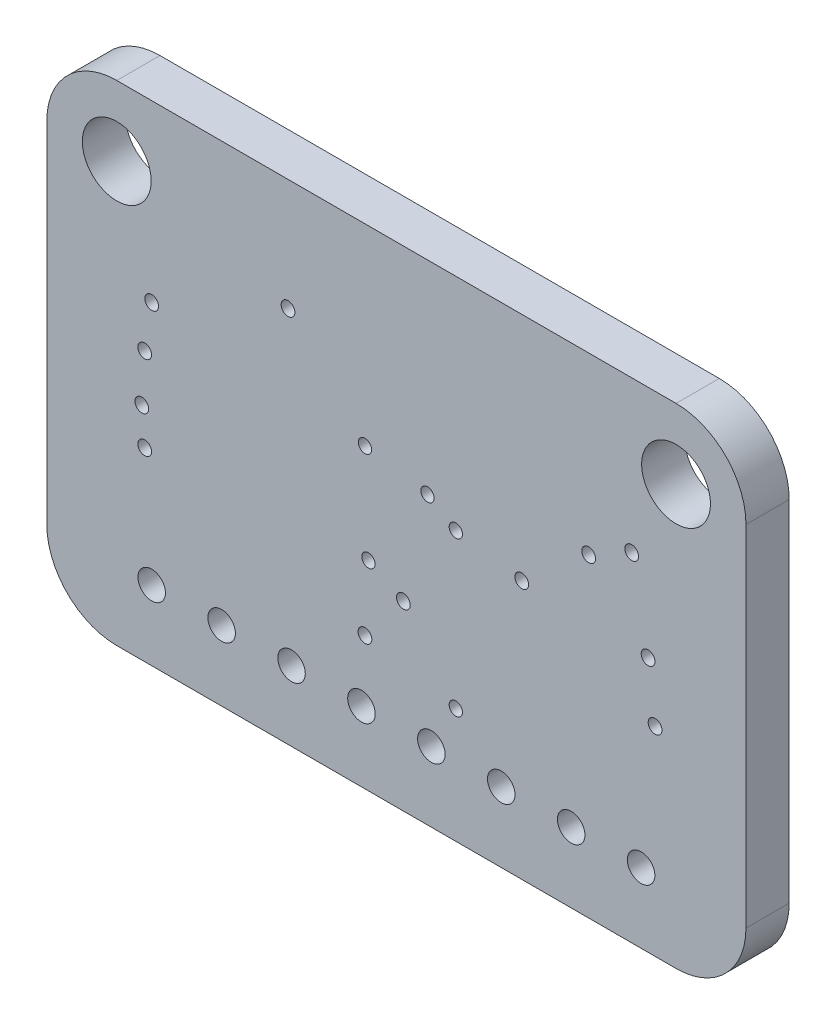
ISO-10303-21;
HEADER;
FILE_DESCRIPTION(('STEP AP214'),'2;1');
FILE_NAME('part.step','',(''),(''),'','','');
FILE_SCHEMA(('AUTOMOTIVE_DESIGN { 1 0 10303 214 1 1 1 1 }'));
ENDSEC;
DATA;
#1=APPLICATION_CONTEXT('core data for automotive mechanical design processes');
#2=APPLICATION_PROTOCOL_DEFINITION('international standard','automotive_design',2000,#1);
#3=PRODUCT_CONTEXT('',#1,'mechanical');
#4=PRODUCT('Part','Part','',(#3));
#5=PRODUCT_RELATED_PRODUCT_CATEGORY('part','',(#4));
#6=PRODUCT_DEFINITION_FORMATION('','',#4);
#7=PRODUCT_DEFINITION_CONTEXT('part definition',#1,'design');
#8=PRODUCT_DEFINITION('design','',#6,#7);
#9=PRODUCT_DEFINITION_SHAPE('','',#8);
#10=(LENGTH_UNIT() NAMED_UNIT(*) SI_UNIT(.MILLI.,.METRE.));
#11=(NAMED_UNIT(*) PLANE_ANGLE_UNIT() SI_UNIT($,.RADIAN.));
#12=(NAMED_UNIT(*) SI_UNIT($,.STERADIAN.) SOLID_ANGLE_UNIT());
#13=UNCERTAINTY_MEASURE_WITH_UNIT(LENGTH_MEASURE(1.E-05),#10,'distance_accuracy_value','');
#14=(GEOMETRIC_REPRESENTATION_CONTEXT(3) GLOBAL_UNCERTAINTY_ASSIGNED_CONTEXT((#13)) GLOBAL_UNIT_ASSIGNED_CONTEXT((#10,
#11,#12)) REPRESENTATION_CONTEXT('',''));
#15=CARTESIAN_POINT('',(0.,0.,0.));
#16=DIRECTION('',(0.,0.,1.));
#17=DIRECTION('',(1.,0.,0.));
#18=AXIS2_PLACEMENT_3D('',#15,#16,#17);
#19=CARTESIAN_POINT('',(12.7,8.89,1.57));
#20=DIRECTION('',(0.,0.,1.));
#21=DIRECTION('',(1.,0.,0.));
#22=AXIS2_PLACEMENT_3D('',#19,#20,#21);
#23=PLANE('',#22);
#24=CARTESIAN_POINT('',(22.86,15.24,1.57));
#25=DIRECTION('',(0.,0.,1.));
#26=DIRECTION('',(1.,0.,0.));
#27=AXIS2_PLACEMENT_3D('',#24,#25,#26);
#28=CIRCLE('',#27,1.25);
#29=CARTESIAN_POINT('',(24.11,15.24,1.57));
#30=VERTEX_POINT('',#29);
#31=EDGE_CURVE('E207',#30,#30,#28,.F.);
#32=ORIENTED_EDGE('',*,*,#31,.T.);
#33=EDGE_LOOP('',(#32));
#34=FACE_BOUND('',#33,.T.);
#35=CARTESIAN_POINT('',(21.59,2.54,1.57));
#36=DIRECTION('',(0.,0.,1.));
#37=DIRECTION('',(1.,0.,0.));
#38=AXIS2_PLACEMENT_3D('',#35,#36,#37);
#39=CIRCLE('',#38,0.5);
#40=CARTESIAN_POINT('',(22.09,2.54,1.57));
#41=VERTEX_POINT('',#40);
#42=EDGE_CURVE('E210',#41,#41,#39,.F.);
#43=ORIENTED_EDGE('',*,*,#42,.T.);
#44=EDGE_LOOP('',(#43));
#45=FACE_BOUND('',#44,.T.);
#46=CARTESIAN_POINT('',(16.51,2.54,1.57));
#47=DIRECTION('',(0.,0.,1.));
#48=DIRECTION('',(1.,0.,0.));
#49=AXIS2_PLACEMENT_3D('',#46,#47,#48);
#50=CIRCLE('',#49,0.5);
#51=CARTESIAN_POINT('',(17.01,2.54,1.57));
#52=VERTEX_POINT('',#51);
#53=EDGE_CURVE('E213',#52,#52,#50,.F.);
#54=ORIENTED_EDGE('',*,*,#53,.T.);
#55=EDGE_LOOP('',(#54));
#56=FACE_BOUND('',#55,.T.);
#57=CARTESIAN_POINT('',(11.43,2.54,1.57));
#58=DIRECTION('',(0.,0.,1.));
#59=DIRECTION('',(1.,0.,0.));
#60=AXIS2_PLACEMENT_3D('',#57,#58,#59);
#61=CIRCLE('',#60,0.5);
#62=CARTESIAN_POINT('',(11.93,2.54,1.57));
#63=VERTEX_POINT('',#62);
#64=EDGE_CURVE('E216',#63,#63,#61,.F.);
#65=ORIENTED_EDGE('',*,*,#64,.T.);
#66=EDGE_LOOP('',(#65));
#67=FACE_BOUND('',#66,.T.);
#68=CARTESIAN_POINT('',(6.35,2.54,1.57));
#69=DIRECTION('',(0.,0.,1.));
#70=DIRECTION('',(1.,0.,0.));
#71=AXIS2_PLACEMENT_3D('',#68,#69,#70);
#72=CIRCLE('',#71,0.5);
#73=CARTESIAN_POINT('',(6.85,2.54,1.57));
#74=VERTEX_POINT('',#73);
#75=EDGE_CURVE('E219',#74,#74,#72,.F.);
#76=ORIENTED_EDGE('',*,*,#75,.T.);
#77=EDGE_LOOP('',(#76));
#78=FACE_BOUND('',#77,.T.);
#79=CARTESIAN_POINT('',(3.556,9.779,1.57));
#80=DIRECTION('',(0.,0.,1.));
#81=DIRECTION('',(1.,0.,0.));
#82=AXIS2_PLACEMENT_3D('',#79,#80,#81);
#83=CIRCLE('',#82,0.25);
#84=CARTESIAN_POINT('',(3.806,9.779,1.57));
#85=VERTEX_POINT('',#84);
#86=EDGE_CURVE('E222',#85,#85,#83,.F.);
#87=ORIENTED_EDGE('',*,*,#86,.T.);
#88=EDGE_LOOP('',(#87));
#89=FACE_BOUND('',#88,.T.);
#90=CARTESIAN_POINT('',(11.557,10.79,1.57));
#91=DIRECTION('',(0.,0.,1.));
#92=DIRECTION('',(1.,0.,0.));
#93=AXIS2_PLACEMENT_3D('',#90,#91,#92);
#94=CIRCLE('',#93,0.2415);
#95=CARTESIAN_POINT('',(11.7985,10.79,1.57));
#96=VERTEX_POINT('',#95);
#97=EDGE_CURVE('E225',#96,#96,#94,.F.);
#98=ORIENTED_EDGE('',*,*,#97,.T.);
#99=EDGE_LOOP('',(#98));
#100=FACE_BOUND('',#99,.T.);
#101=CARTESIAN_POINT('',(11.557,4.826,1.57));
#102=DIRECTION('',(0.,0.,1.));
#103=DIRECTION('',(1.,0.,0.));
#104=AXIS2_PLACEMENT_3D('',#101,#102,#103);
#105=CIRCLE('',#104,0.25);
#106=CARTESIAN_POINT('',(11.807,4.826,1.57));
#107=VERTEX_POINT('',#106);
#108=EDGE_CURVE('E228',#107,#107,#105,.F.);
#109=ORIENTED_EDGE('',*,*,#108,.T.);
#110=EDGE_LOOP('',(#109));
#111=FACE_BOUND('',#110,.T.);
#112=CARTESIAN_POINT('',(17.253,9.398,1.57));
#113=DIRECTION('',(0.,0.,1.));
#114=DIRECTION('',(1.,0.,0.));
#115=AXIS2_PLACEMENT_3D('',#112,#113,#114);
#116=CIRCLE('',#115,0.25);
#117=CARTESIAN_POINT('',(17.503,9.398,1.57));
#118=VERTEX_POINT('',#117);
#119=EDGE_CURVE('E231',#118,#118,#116,.F.);
#120=ORIENTED_EDGE('',*,*,#119,.T.);
#121=EDGE_LOOP('',(#120));
#122=FACE_BOUND('',#121,.T.);
#123=CARTESIAN_POINT('',(3.452,8.024,1.57));
#124=DIRECTION('',(0.,0.,1.));
#125=DIRECTION('',(1.,0.,0.));
#126=AXIS2_PLACEMENT_3D('',#123,#124,#125);
#127=CIRCLE('',#126,0.25);
#128=CARTESIAN_POINT('',(3.702,8.024,1.57));
#129=VERTEX_POINT('',#128);
#130=EDGE_CURVE('E234',#129,#129,#127,.F.);
#131=ORIENTED_EDGE('',*,*,#130,.T.);
#132=EDGE_LOOP('',(#131));
#133=FACE_BOUND('',#132,.T.);
#134=CARTESIAN_POINT('',(14.859,4.178,1.57));
#135=DIRECTION('',(0.,0.,1.));
#136=DIRECTION('',(1.,0.,0.));
#137=AXIS2_PLACEMENT_3D('',#134,#135,#136);
#138=CIRCLE('',#137,0.2415);
#139=CARTESIAN_POINT('',(15.1005,4.178,1.57));
#140=VERTEX_POINT('',#139);
#141=EDGE_CURVE('E237',#140,#140,#138,.F.);
#142=ORIENTED_EDGE('',*,*,#141,.T.);
#143=EDGE_LOOP('',(#142));
#144=FACE_BOUND('',#143,.T.);
#145=CARTESIAN_POINT('',(11.684,7.252,1.57));
#146=DIRECTION('',(0.,0.,1.));
#147=DIRECTION('',(1.,0.,0.));
#148=AXIS2_PLACEMENT_3D('',#145,#146,#147);
#149=CIRCLE('',#148,0.2415);
#150=CARTESIAN_POINT('',(11.9255,7.252,1.57));
#151=VERTEX_POINT('',#150);
#152=EDGE_CURVE('E240',#151,#151,#149,.F.);
#153=ORIENTED_EDGE('',*,*,#152,.T.);
#154=EDGE_LOOP('',(#153));
#155=FACE_BOUND('',#154,.T.);
#156=CARTESIAN_POINT('',(12.954,6.604,1.57));
#157=DIRECTION('',(0.,0.,1.));
#158=DIRECTION('',(1.,0.,0.));
#159=AXIS2_PLACEMENT_3D('',#156,#157,#158);
#160=CIRCLE('',#159,0.25);
#161=CARTESIAN_POINT('',(13.204,6.604,1.57));
#162=VERTEX_POINT('',#161);
#163=EDGE_CURVE('E243',#162,#162,#160,.F.);
#164=ORIENTED_EDGE('',*,*,#163,.T.);
#165=EDGE_LOOP('',(#164));
#166=FACE_BOUND('',#165,.T.);
#167=CARTESIAN_POINT('',(22.098,7.239,1.57));
#168=DIRECTION('',(0.,0.,1.));
#169=DIRECTION('',(1.,0.,0.));
#170=AXIS2_PLACEMENT_3D('',#167,#168,#169);
#171=CIRCLE('',#170,0.25);
#172=CARTESIAN_POINT('',(22.348,7.239,1.57));
#173=VERTEX_POINT('',#172);
#174=EDGE_CURVE('E246',#173,#173,#171,.F.);
#175=ORIENTED_EDGE('',*,*,#174,.T.);
#176=EDGE_LOOP('',(#175));
#177=FACE_BOUND('',#176,.T.);
#178=CARTESIAN_POINT('',(8.763,13.716,1.57));
#179=DIRECTION('',(0.,0.,1.));
#180=DIRECTION('',(1.,0.,0.));
#181=AXIS2_PLACEMENT_3D('',#178,#179,#180);
#182=CIRCLE('',#181,0.25);
#183=CARTESIAN_POINT('',(9.013,13.716,1.57));
#184=VERTEX_POINT('',#183);
#185=EDGE_CURVE('E249',#184,#184,#182,.F.);
#186=ORIENTED_EDGE('',*,*,#185,.T.);
#187=EDGE_LOOP('',(#186));
#188=FACE_BOUND('',#187,.T.);
#189=CARTESIAN_POINT('',(19.685,11.43,1.57));
#190=DIRECTION('',(0.,0.,1.));
#191=DIRECTION('',(1.,0.,0.));
#192=AXIS2_PLACEMENT_3D('',#189,#190,#191);
#193=CIRCLE('',#192,0.25);
#194=CARTESIAN_POINT('',(19.935,11.43,1.57));
#195=VERTEX_POINT('',#194);
#196=EDGE_CURVE('E252',#195,#195,#193,.F.);
#197=ORIENTED_EDGE('',*,*,#196,.T.);
#198=EDGE_LOOP('',(#197));
#199=FACE_BOUND('',#198,.T.);
#200=CARTESIAN_POINT('',(13.83,10.401,1.57));
#201=DIRECTION('',(0.,0.,1.));
#202=DIRECTION('',(1.,0.,0.));
#203=AXIS2_PLACEMENT_3D('',#200,#201,#202);
#204=CIRCLE('',#203,0.2415);
#205=CARTESIAN_POINT('',(14.0715,10.401,1.57));
#206=VERTEX_POINT('',#205);
#207=EDGE_CURVE('E255',#206,#206,#204,.F.);
#208=ORIENTED_EDGE('',*,*,#207,.T.);
#209=EDGE_LOOP('',(#208));
#210=FACE_BOUND('',#209,.T.);
#211=CARTESIAN_POINT('',(14.859,9.779,1.57));
#212=DIRECTION('',(0.,0.,1.));
#213=DIRECTION('',(1.,0.,0.));
#214=AXIS2_PLACEMENT_3D('',#211,#212,#213);
#215=CIRCLE('',#214,0.2415);
#216=CARTESIAN_POINT('',(15.1005,9.779,1.57));
#217=VERTEX_POINT('',#216);
#218=EDGE_CURVE('E258',#217,#217,#215,.F.);
#219=ORIENTED_EDGE('',*,*,#218,.T.);
#220=EDGE_LOOP('',(#219));
#221=FACE_BOUND('',#220,.T.);
#222=CARTESIAN_POINT('',(21.844,9.271,1.57));
#223=DIRECTION('',(0.,0.,1.));
#224=DIRECTION('',(1.,0.,0.));
#225=AXIS2_PLACEMENT_3D('',#222,#223,#224);
#226=CIRCLE('',#225,0.25);
#227=CARTESIAN_POINT('',(22.094,9.271,1.57));
#228=VERTEX_POINT('',#227);
#229=EDGE_CURVE('E261',#228,#228,#226,.F.);
#230=ORIENTED_EDGE('',*,*,#229,.T.);
#231=EDGE_LOOP('',(#230));
#232=FACE_BOUND('',#231,.T.);
#233=CARTESIAN_POINT('',(3.556,6.731,1.57));
#234=DIRECTION('',(0.,0.,1.));
#235=DIRECTION('',(1.,0.,0.));
#236=AXIS2_PLACEMENT_3D('',#233,#234,#235);
#237=CIRCLE('',#236,0.25);
#238=CARTESIAN_POINT('',(3.806,6.731,1.57));
#239=VERTEX_POINT('',#238);
#240=EDGE_CURVE('E264',#239,#239,#237,.F.);
#241=ORIENTED_EDGE('',*,*,#240,.T.);
#242=EDGE_LOOP('',(#241));
#243=FACE_BOUND('',#242,.T.);
#244=CARTESIAN_POINT('',(3.81,11.43,1.57));
#245=DIRECTION('',(0.,0.,1.));
#246=DIRECTION('',(1.,0.,0.));
#247=AXIS2_PLACEMENT_3D('',#244,#245,#246);
#248=CIRCLE('',#247,0.25);
#249=CARTESIAN_POINT('',(4.06,11.43,1.57));
#250=VERTEX_POINT('',#249);
#251=EDGE_CURVE('E267',#250,#250,#248,.F.);
#252=ORIENTED_EDGE('',*,*,#251,.T.);
#253=EDGE_LOOP('',(#252));
#254=FACE_BOUND('',#253,.T.);
#255=CARTESIAN_POINT('',(21.248,12.28,1.57));
#256=DIRECTION('',(0.,0.,1.));
#257=DIRECTION('',(1.,0.,0.));
#258=AXIS2_PLACEMENT_3D('',#255,#256,#257);
#259=CIRCLE('',#258,0.25);
#260=CARTESIAN_POINT('',(21.498,12.28,1.57));
#261=VERTEX_POINT('',#260);
#262=EDGE_CURVE('E270',#261,#261,#259,.F.);
#263=ORIENTED_EDGE('',*,*,#262,.T.);
#264=EDGE_LOOP('',(#263));
#265=FACE_BOUND('',#264,.T.);
#266=CARTESIAN_POINT('',(3.81,2.54,1.57));
#267=DIRECTION('',(0.,0.,1.));
#268=DIRECTION('',(1.,0.,0.));
#269=AXIS2_PLACEMENT_3D('',#266,#267,#268);
#270=CIRCLE('',#269,0.5);
#271=CARTESIAN_POINT('',(4.31,2.54,1.57));
#272=VERTEX_POINT('',#271);
#273=EDGE_CURVE('E273',#272,#272,#270,.F.);
#274=ORIENTED_EDGE('',*,*,#273,.T.);
#275=EDGE_LOOP('',(#274));
#276=FACE_BOUND('',#275,.T.);
#277=CARTESIAN_POINT('',(8.89,2.54,1.57));
#278=DIRECTION('',(0.,0.,1.));
#279=DIRECTION('',(1.,0.,0.));
#280=AXIS2_PLACEMENT_3D('',#277,#278,#279);
#281=CIRCLE('',#280,0.5);
#282=CARTESIAN_POINT('',(9.39,2.54,1.57));
#283=VERTEX_POINT('',#282);
#284=EDGE_CURVE('E276',#283,#283,#281,.F.);
#285=ORIENTED_EDGE('',*,*,#284,.T.);
#286=EDGE_LOOP('',(#285));
#287=FACE_BOUND('',#286,.T.);
#288=CARTESIAN_POINT('',(13.97,2.54,1.57));
#289=DIRECTION('',(0.,0.,1.));
#290=DIRECTION('',(1.,0.,0.));
#291=AXIS2_PLACEMENT_3D('',#288,#289,#290);
#292=CIRCLE('',#291,0.5);
#293=CARTESIAN_POINT('',(14.47,2.54,1.57));
#294=VERTEX_POINT('',#293);
#295=EDGE_CURVE('E279',#294,#294,#292,.F.);
#296=ORIENTED_EDGE('',*,*,#295,.T.);
#297=EDGE_LOOP('',(#296));
#298=FACE_BOUND('',#297,.T.);
#299=CARTESIAN_POINT('',(19.05,2.54,1.57));
#300=DIRECTION('',(0.,0.,1.));
#301=DIRECTION('',(1.,0.,0.));
#302=AXIS2_PLACEMENT_3D('',#299,#300,#301);
#303=CIRCLE('',#302,0.5);
#304=CARTESIAN_POINT('',(19.55,2.54,1.57));
#305=VERTEX_POINT('',#304);
#306=EDGE_CURVE('E282',#305,#305,#303,.F.);
#307=ORIENTED_EDGE('',*,*,#306,.T.);
#308=EDGE_LOOP('',(#307));
#309=FACE_BOUND('',#308,.T.);
#310=CARTESIAN_POINT('',(2.54,15.24,1.57));
#311=DIRECTION('',(0.,0.,1.));
#312=DIRECTION('',(1.,0.,0.));
#313=AXIS2_PLACEMENT_3D('',#310,#311,#312);
#314=CIRCLE('',#313,1.25);
#315=CARTESIAN_POINT('',(3.79,15.24,1.57));
#316=VERTEX_POINT('',#315);
#317=EDGE_CURVE('E285',#316,#316,#314,.F.);
#318=ORIENTED_EDGE('',*,*,#317,.T.);
#319=EDGE_LOOP('',(#318));
#320=FACE_BOUND('',#319,.T.);
#321=CARTESIAN_POINT('',(22.86,15.24,1.57));
#322=DIRECTION('',(0.,0.,1.));
#323=DIRECTION('',(1.,0.,0.));
#324=AXIS2_PLACEMENT_3D('',#321,#322,#323);
#325=CIRCLE('',#324,2.54);
#326=CARTESIAN_POINT('',(22.86,17.78,1.57));
#327=VERTEX_POINT('',#326);
#328=CARTESIAN_POINT('',(25.4,15.24,1.57));
#329=VERTEX_POINT('',#328);
#330=EDGE_CURVE('E290',#327,#329,#325,.F.);
#331=ORIENTED_EDGE('',*,*,#330,.F.);
#332=DIRECTION('',(1.,0.,0.));
#333=VECTOR('',#332,1.);
#334=CARTESIAN_POINT('',(22.86,17.78,1.57));
#335=LINE('',#334,#333);
#336=CARTESIAN_POINT('',(2.54,17.78,1.57));
#337=VERTEX_POINT('',#336);
#338=EDGE_CURVE('E109',#337,#327,#335,.T.);
#339=ORIENTED_EDGE('',*,*,#338,.F.);
#340=CARTESIAN_POINT('',(2.54,15.24,1.57));
#341=DIRECTION('',(0.,0.,1.));
#342=DIRECTION('',(1.,0.,0.));
#343=AXIS2_PLACEMENT_3D('',#340,#341,#342);
#344=CIRCLE('',#343,2.54);
#345=CARTESIAN_POINT('',(0.,15.24,1.57));
#346=VERTEX_POINT('',#345);
#347=EDGE_CURVE('E96',#346,#337,#344,.F.);
#348=ORIENTED_EDGE('',*,*,#347,.F.);
#349=DIRECTION('',(0.,1.,0.));
#350=VECTOR('',#349,1.);
#351=CARTESIAN_POINT('',(0.,15.24,1.57));
#352=LINE('',#351,#350);
#353=CARTESIAN_POINT('',(0.,2.54,1.57));
#354=VERTEX_POINT('',#353);
#355=EDGE_CURVE('E92',#354,#346,#352,.T.);
#356=ORIENTED_EDGE('',*,*,#355,.F.);
#357=CARTESIAN_POINT('',(2.54,2.54,1.57));
#358=DIRECTION('',(0.,0.,1.));
#359=DIRECTION('',(1.,0.,0.));
#360=AXIS2_PLACEMENT_3D('',#357,#358,#359);
#361=CIRCLE('',#360,2.54);
#362=CARTESIAN_POINT('',(2.54,0.,1.57));
#363=VERTEX_POINT('',#362);
#364=EDGE_CURVE('E20',#363,#354,#361,.F.);
#365=ORIENTED_EDGE('',*,*,#364,.F.);
#366=DIRECTION('',(1.,0.,0.));
#367=VECTOR('',#366,1.);
#368=CARTESIAN_POINT('',(2.54,0.,1.57));
#369=LINE('',#368,#367);
#370=CARTESIAN_POINT('',(22.86,0.,1.57));
#371=VERTEX_POINT('',#370);
#372=EDGE_CURVE('E79',#371,#363,#369,.F.);
#373=ORIENTED_EDGE('',*,*,#372,.F.);
#374=CARTESIAN_POINT('',(22.86,2.54,1.57));
#375=DIRECTION('',(0.,0.,1.));
#376=DIRECTION('',(1.,0.,0.));
#377=AXIS2_PLACEMENT_3D('',#374,#375,#376);
#378=CIRCLE('',#377,2.54);
#379=CARTESIAN_POINT('',(25.4,2.54,1.57));
#380=VERTEX_POINT('',#379);
#381=EDGE_CURVE('E291',#380,#371,#378,.F.);
#382=ORIENTED_EDGE('',*,*,#381,.F.);
#383=DIRECTION('',(0.,1.,0.));
#384=VECTOR('',#383,1.);
#385=CARTESIAN_POINT('',(25.4,2.54,1.57));
#386=LINE('',#385,#384);
#387=EDGE_CURVE('E113',#329,#380,#386,.F.);
#388=ORIENTED_EDGE('',*,*,#387,.F.);
#389=EDGE_LOOP('',(#331,#339,#348,#356,#365,#373,#382,#388));
#390=FACE_BOUND('',#389,.T.);
#391=ADVANCED_FACE('F17',(#34,#45,#56,#67,#78,#89,#100,#111,#122,#133,#144,#155,#166,#177,#188,
#199,#210,#221,#232,#243,#254,#265,#276,#287,#298,#309,#320,#390),#23,.T.);
#392=CARTESIAN_POINT('',(0.,15.24,0.));
#393=DIRECTION('',(-1.,0.,0.));
#394=DIRECTION('',(0.,0.,1.));
#395=AXIS2_PLACEMENT_3D('',#392,#393,#394);
#396=PLANE('',#395);
#397=ORIENTED_EDGE('',*,*,#355,.T.);
#398=DIRECTION('',(0.,0.,1.));
#399=VECTOR('',#398,1.);
#400=CARTESIAN_POINT('',(0.,15.24,0.));
#401=LINE('',#400,#399);
#402=CARTESIAN_POINT('',(0.,15.24,0.));
#403=VERTEX_POINT('',#402);
#404=EDGE_CURVE('E289',#403,#346,#401,.T.);
#405=ORIENTED_EDGE('',*,*,#404,.F.);
#406=DIRECTION('',(0.,1.,0.));
#407=VECTOR('',#406,1.);
#408=CARTESIAN_POINT('',(0.,8.89,0.));
#409=LINE('',#408,#407);
#410=CARTESIAN_POINT('',(0.,2.54,0.));
#411=VERTEX_POINT('',#410);
#412=EDGE_CURVE('E103',#403,#411,#409,.F.);
#413=ORIENTED_EDGE('',*,*,#412,.T.);
#414=DIRECTION('',(0.,0.,1.));
#415=VECTOR('',#414,1.);
#416=CARTESIAN_POINT('',(0.,2.54,0.));
#417=LINE('',#416,#415);
#418=EDGE_CURVE('E88',#354,#411,#417,.F.);
#419=ORIENTED_EDGE('',*,*,#418,.F.);
#420=EDGE_LOOP('',(#397,#405,#413,#419));
#421=FACE_BOUND('',#420,.T.);
#422=ADVANCED_FACE('F102',(#421),#396,.T.);
#423=CARTESIAN_POINT('',(2.54,2.54,0.));
#424=DIRECTION('',(0.,0.,1.));
#425=DIRECTION('',(1.,0.,0.));
#426=AXIS2_PLACEMENT_3D('',#423,#424,#425);
#427=CYLINDRICAL_SURFACE('',#426,2.54);
#428=ORIENTED_EDGE('',*,*,#364,.T.);
#429=ORIENTED_EDGE('',*,*,#418,.T.);
#430=CARTESIAN_POINT('',(2.54,2.54,0.));
#431=DIRECTION('',(0.,0.,1.));
#432=DIRECTION('',(1.,0.,0.));
#433=AXIS2_PLACEMENT_3D('',#430,#431,#432);
#434=CIRCLE('',#433,2.54);
#435=CARTESIAN_POINT('',(2.54,0.,0.));
#436=VERTEX_POINT('',#435);
#437=EDGE_CURVE('E205',#411,#436,#434,.T.);
#438=ORIENTED_EDGE('',*,*,#437,.T.);
#439=DIRECTION('',(0.,0.,-1.));
#440=VECTOR('',#439,1.);
#441=CARTESIAN_POINT('',(2.54,0.,0.));
#442=LINE('',#441,#440);
#443=EDGE_CURVE('E90',#363,#436,#442,.T.);
#444=ORIENTED_EDGE('',*,*,#443,.F.);
#445=EDGE_LOOP('',(#428,#429,#438,#444));
#446=FACE_BOUND('',#445,.T.);
#447=ADVANCED_FACE('F85',(#446),#427,.T.);
#448=CARTESIAN_POINT('',(2.54,0.,0.));
#449=DIRECTION('',(0.,-1.,0.));
#450=DIRECTION('',(0.,0.,-1.));
#451=AXIS2_PLACEMENT_3D('',#448,#449,#450);
#452=PLANE('',#451);
#453=ORIENTED_EDGE('',*,*,#372,.T.);
#454=ORIENTED_EDGE('',*,*,#443,.T.);
#455=DIRECTION('',(1.,0.,0.));
#456=VECTOR('',#455,1.);
#457=CARTESIAN_POINT('',(12.7,0.,0.));
#458=LINE('',#457,#456);
#459=CARTESIAN_POINT('',(22.86,0.,0.));
#460=VERTEX_POINT('',#459);
#461=EDGE_CURVE('E204',#436,#460,#458,.T.);
#462=ORIENTED_EDGE('',*,*,#461,.T.);
#463=DIRECTION('',(0.,0.,1.));
#464=VECTOR('',#463,1.);
#465=CARTESIAN_POINT('',(22.86,0.,0.));
#466=LINE('',#465,#464);
#467=EDGE_CURVE('E115',#371,#460,#466,.F.);
#468=ORIENTED_EDGE('',*,*,#467,.F.);
#469=EDGE_LOOP('',(#453,#454,#462,#468));
#470=FACE_BOUND('',#469,.T.);
#471=ADVANCED_FACE('F297',(#470),#452,.T.);
#472=CARTESIAN_POINT('',(22.86,2.54,0.));
#473=DIRECTION('',(0.,0.,1.));
#474=DIRECTION('',(1.,0.,0.));
#475=AXIS2_PLACEMENT_3D('',#472,#473,#474);
#476=CYLINDRICAL_SURFACE('',#475,2.54);
#477=ORIENTED_EDGE('',*,*,#381,.T.);
#478=ORIENTED_EDGE('',*,*,#467,.T.);
#479=CARTESIAN_POINT('',(22.86,2.54,0.));
#480=DIRECTION('',(0.,0.,1.));
#481=DIRECTION('',(1.,0.,0.));
#482=AXIS2_PLACEMENT_3D('',#479,#480,#481);
#483=CIRCLE('',#482,2.54);
#484=CARTESIAN_POINT('',(25.4,2.54,0.));
#485=VERTEX_POINT('',#484);
#486=EDGE_CURVE('E201',#460,#485,#483,.T.);
#487=ORIENTED_EDGE('',*,*,#486,.T.);
#488=DIRECTION('',(0.,0.,-1.));
#489=VECTOR('',#488,1.);
#490=CARTESIAN_POINT('',(25.4,2.54,0.));
#491=LINE('',#490,#489);
#492=EDGE_CURVE('E114',#380,#485,#491,.T.);
#493=ORIENTED_EDGE('',*,*,#492,.F.);
#494=EDGE_LOOP('',(#477,#478,#487,#493));
#495=FACE_BOUND('',#494,.T.);
#496=ADVANCED_FACE('F318',(#495),#476,.T.);
#497=CARTESIAN_POINT('',(25.4,2.54,0.));
#498=DIRECTION('',(1.,0.,0.));
#499=DIRECTION('',(0.,0.,-1.));
#500=AXIS2_PLACEMENT_3D('',#497,#498,#499);
#501=PLANE('',#500);
#502=ORIENTED_EDGE('',*,*,#387,.T.);
#503=ORIENTED_EDGE('',*,*,#492,.T.);
#504=DIRECTION('',(0.,1.,0.));
#505=VECTOR('',#504,1.);
#506=CARTESIAN_POINT('',(25.4,8.89,0.));
#507=LINE('',#506,#505);
#508=CARTESIAN_POINT('',(25.4,15.24,0.));
#509=VERTEX_POINT('',#508);
#510=EDGE_CURVE('E200',#485,#509,#507,.T.);
#511=ORIENTED_EDGE('',*,*,#510,.T.);
#512=DIRECTION('',(0.,0.,1.));
#513=VECTOR('',#512,1.);
#514=CARTESIAN_POINT('',(25.4,15.24,0.));
#515=LINE('',#514,#513);
#516=EDGE_CURVE('E111',#329,#509,#515,.F.);
#517=ORIENTED_EDGE('',*,*,#516,.F.);
#518=EDGE_LOOP('',(#502,#503,#511,#517));
#519=FACE_BOUND('',#518,.T.);
#520=ADVANCED_FACE('F314',(#519),#501,.T.);
#521=CARTESIAN_POINT('',(22.86,15.24,0.));
#522=DIRECTION('',(0.,0.,1.));
#523=DIRECTION('',(1.,0.,0.));
#524=AXIS2_PLACEMENT_3D('',#521,#522,#523);
#525=CYLINDRICAL_SURFACE('',#524,2.54);
#526=ORIENTED_EDGE('',*,*,#330,.T.);
#527=ORIENTED_EDGE('',*,*,#516,.T.);
#528=CARTESIAN_POINT('',(22.86,15.24,0.));
#529=DIRECTION('',(0.,0.,1.));
#530=DIRECTION('',(1.,0.,0.));
#531=AXIS2_PLACEMENT_3D('',#528,#529,#530);
#532=CIRCLE('',#531,2.54);
#533=CARTESIAN_POINT('',(22.86,17.78,0.));
#534=VERTEX_POINT('',#533);
#535=EDGE_CURVE('E197',#509,#534,#532,.T.);
#536=ORIENTED_EDGE('',*,*,#535,.T.);
#537=DIRECTION('',(0.,0.,1.));
#538=VECTOR('',#537,1.);
#539=CARTESIAN_POINT('',(22.86,17.78,0.));
#540=LINE('',#539,#538);
#541=EDGE_CURVE('E110',#327,#534,#540,.F.);
#542=ORIENTED_EDGE('',*,*,#541,.F.);
#543=EDGE_LOOP('',(#526,#527,#536,#542));
#544=FACE_BOUND('',#543,.T.);
#545=ADVANCED_FACE('F326',(#544),#525,.T.);
#546=CARTESIAN_POINT('',(22.86,17.78,0.));
#547=DIRECTION('',(0.,1.,0.));
#548=DIRECTION('',(0.,0.,1.));
#549=AXIS2_PLACEMENT_3D('',#546,#547,#548);
#550=PLANE('',#549);
#551=ORIENTED_EDGE('',*,*,#338,.T.);
#552=ORIENTED_EDGE('',*,*,#541,.T.);
#553=DIRECTION('',(1.,0.,0.));
#554=VECTOR('',#553,1.);
#555=CARTESIAN_POINT('',(12.7,17.78,0.));
#556=LINE('',#555,#554);
#557=CARTESIAN_POINT('',(2.54,17.78,0.));
#558=VERTEX_POINT('',#557);
#559=EDGE_CURVE('E196',#534,#558,#556,.F.);
#560=ORIENTED_EDGE('',*,*,#559,.T.);
#561=DIRECTION('',(0.,0.,1.));
#562=VECTOR('',#561,1.);
#563=CARTESIAN_POINT('',(2.54,17.78,0.));
#564=LINE('',#563,#562);
#565=EDGE_CURVE('E35',#337,#558,#564,.F.);
#566=ORIENTED_EDGE('',*,*,#565,.F.);
#567=EDGE_LOOP('',(#551,#552,#560,#566));
#568=FACE_BOUND('',#567,.T.);
#569=ADVANCED_FACE('F448',(#568),#550,.T.);
#570=CARTESIAN_POINT('',(2.54,15.24,0.));
#571=DIRECTION('',(0.,0.,1.));
#572=DIRECTION('',(1.,0.,0.));
#573=AXIS2_PLACEMENT_3D('',#570,#571,#572);
#574=CYLINDRICAL_SURFACE('',#573,2.54);
#575=ORIENTED_EDGE('',*,*,#347,.T.);
#576=ORIENTED_EDGE('',*,*,#565,.T.);
#577=CARTESIAN_POINT('',(2.54,15.24,0.));
#578=DIRECTION('',(0.,0.,1.));
#579=DIRECTION('',(1.,0.,0.));
#580=AXIS2_PLACEMENT_3D('',#577,#578,#579);
#581=CIRCLE('',#580,2.54);
#582=EDGE_CURVE('E194',#558,#403,#581,.T.);
#583=ORIENTED_EDGE('',*,*,#582,.T.);
#584=ORIENTED_EDGE('',*,*,#404,.T.);
#585=EDGE_LOOP('',(#575,#576,#583,#584));
#586=FACE_BOUND('',#585,.T.);
#587=ADVANCED_FACE('F444',(#586),#574,.T.);
#588=CARTESIAN_POINT('',(2.54,15.24,0.));
#589=DIRECTION('',(0.,0.,1.));
#590=DIRECTION('',(1.,0.,0.));
#591=AXIS2_PLACEMENT_3D('',#588,#589,#590);
#592=CYLINDRICAL_SURFACE('',#591,1.25);
#593=ORIENTED_EDGE('',*,*,#317,.F.);
#594=EDGE_LOOP('',(#593));
#595=FACE_BOUND('',#594,.T.);
#596=CARTESIAN_POINT('',(2.54,15.24,0.));
#597=DIRECTION('',(0.,0.,1.));
#598=DIRECTION('',(1.,0.,0.));
#599=AXIS2_PLACEMENT_3D('',#596,#597,#598);
#600=CIRCLE('',#599,1.25);
#601=CARTESIAN_POINT('',(3.79,15.24,0.));
#602=VERTEX_POINT('',#601);
#603=EDGE_CURVE('E191',#602,#602,#600,.F.);
#604=ORIENTED_EDGE('',*,*,#603,.T.);
#605=EDGE_LOOP('',(#604));
#606=FACE_BOUND('',#605,.T.);
#607=ADVANCED_FACE('F440',(#595,#606),#592,.F.);
#608=CARTESIAN_POINT('',(19.05,2.54,0.));
#609=DIRECTION('',(0.,0.,1.));
#610=DIRECTION('',(1.,0.,0.));
#611=AXIS2_PLACEMENT_3D('',#608,#609,#610);
#612=CYLINDRICAL_SURFACE('',#611,0.5);
#613=ORIENTED_EDGE('',*,*,#306,.F.);
#614=EDGE_LOOP('',(#613));
#615=FACE_BOUND('',#614,.T.);
#616=CARTESIAN_POINT('',(19.05,2.54,0.));
#617=DIRECTION('',(0.,0.,1.));
#618=DIRECTION('',(1.,0.,0.));
#619=AXIS2_PLACEMENT_3D('',#616,#617,#618);
#620=CIRCLE('',#619,0.5);
#621=CARTESIAN_POINT('',(19.55,2.54,0.));
#622=VERTEX_POINT('',#621);
#623=EDGE_CURVE('E188',#622,#622,#620,.F.);
#624=ORIENTED_EDGE('',*,*,#623,.T.);
#625=EDGE_LOOP('',(#624));
#626=FACE_BOUND('',#625,.T.);
#627=ADVANCED_FACE('F436',(#615,#626),#612,.F.);
#628=CARTESIAN_POINT('',(13.97,2.54,0.));
#629=DIRECTION('',(0.,0.,1.));
#630=DIRECTION('',(1.,0.,0.));
#631=AXIS2_PLACEMENT_3D('',#628,#629,#630);
#632=CYLINDRICAL_SURFACE('',#631,0.5);
#633=ORIENTED_EDGE('',*,*,#295,.F.);
#634=EDGE_LOOP('',(#633));
#635=FACE_BOUND('',#634,.T.);
#636=CARTESIAN_POINT('',(13.97,2.54,0.));
#637=DIRECTION('',(0.,0.,1.));
#638=DIRECTION('',(1.,0.,0.));
#639=AXIS2_PLACEMENT_3D('',#636,#637,#638);
#640=CIRCLE('',#639,0.5);
#641=CARTESIAN_POINT('',(14.47,2.54,0.));
#642=VERTEX_POINT('',#641);
#643=EDGE_CURVE('E185',#642,#642,#640,.F.);
#644=ORIENTED_EDGE('',*,*,#643,.T.);
#645=EDGE_LOOP('',(#644));
#646=FACE_BOUND('',#645,.T.);
#647=ADVANCED_FACE('F432',(#635,#646),#632,.F.);
#648=CARTESIAN_POINT('',(8.89,2.54,0.));
#649=DIRECTION('',(0.,0.,1.));
#650=DIRECTION('',(1.,0.,0.));
#651=AXIS2_PLACEMENT_3D('',#648,#649,#650);
#652=CYLINDRICAL_SURFACE('',#651,0.5);
#653=ORIENTED_EDGE('',*,*,#284,.F.);
#654=EDGE_LOOP('',(#653));
#655=FACE_BOUND('',#654,.T.);
#656=CARTESIAN_POINT('',(8.89,2.54,0.));
#657=DIRECTION('',(0.,0.,1.));
#658=DIRECTION('',(1.,0.,0.));
#659=AXIS2_PLACEMENT_3D('',#656,#657,#658);
#660=CIRCLE('',#659,0.5);
#661=CARTESIAN_POINT('',(9.39,2.54,0.));
#662=VERTEX_POINT('',#661);
#663=EDGE_CURVE('E182',#662,#662,#660,.F.);
#664=ORIENTED_EDGE('',*,*,#663,.T.);
#665=EDGE_LOOP('',(#664));
#666=FACE_BOUND('',#665,.T.);
#667=ADVANCED_FACE('F428',(#655,#666),#652,.F.);
#668=CARTESIAN_POINT('',(3.81,2.54,0.));
#669=DIRECTION('',(0.,0.,1.));
#670=DIRECTION('',(1.,0.,0.));
#671=AXIS2_PLACEMENT_3D('',#668,#669,#670);
#672=CYLINDRICAL_SURFACE('',#671,0.5);
#673=ORIENTED_EDGE('',*,*,#273,.F.);
#674=EDGE_LOOP('',(#673));
#675=FACE_BOUND('',#674,.T.);
#676=CARTESIAN_POINT('',(3.81,2.54,0.));
#677=DIRECTION('',(0.,0.,1.));
#678=DIRECTION('',(1.,0.,0.));
#679=AXIS2_PLACEMENT_3D('',#676,#677,#678);
#680=CIRCLE('',#679,0.5);
#681=CARTESIAN_POINT('',(4.31,2.54,0.));
#682=VERTEX_POINT('',#681);
#683=EDGE_CURVE('E179',#682,#682,#680,.F.);
#684=ORIENTED_EDGE('',*,*,#683,.T.);
#685=EDGE_LOOP('',(#684));
#686=FACE_BOUND('',#685,.T.);
#687=ADVANCED_FACE('F424',(#675,#686),#672,.F.);
#688=CARTESIAN_POINT('',(21.248,12.28,0.));
#689=DIRECTION('',(0.,0.,1.));
#690=DIRECTION('',(1.,0.,0.));
#691=AXIS2_PLACEMENT_3D('',#688,#689,#690);
#692=CYLINDRICAL_SURFACE('',#691,0.25);
#693=ORIENTED_EDGE('',*,*,#262,.F.);
#694=EDGE_LOOP('',(#693));
#695=FACE_BOUND('',#694,.T.);
#696=CARTESIAN_POINT('',(21.248,12.28,0.));
#697=DIRECTION('',(0.,0.,1.));
#698=DIRECTION('',(1.,0.,0.));
#699=AXIS2_PLACEMENT_3D('',#696,#697,#698);
#700=CIRCLE('',#699,0.25);
#701=CARTESIAN_POINT('',(21.498,12.28,0.));
#702=VERTEX_POINT('',#701);
#703=EDGE_CURVE('E176',#702,#702,#700,.F.);
#704=ORIENTED_EDGE('',*,*,#703,.T.);
#705=EDGE_LOOP('',(#704));
#706=FACE_BOUND('',#705,.T.);
#707=ADVANCED_FACE('F420',(#695,#706),#692,.F.);
#708=CARTESIAN_POINT('',(3.81,11.43,0.));
#709=DIRECTION('',(0.,0.,1.));
#710=DIRECTION('',(1.,0.,0.));
#711=AXIS2_PLACEMENT_3D('',#708,#709,#710);
#712=CYLINDRICAL_SURFACE('',#711,0.25);
#713=ORIENTED_EDGE('',*,*,#251,.F.);
#714=EDGE_LOOP('',(#713));
#715=FACE_BOUND('',#714,.T.);
#716=CARTESIAN_POINT('',(3.81,11.43,0.));
#717=DIRECTION('',(0.,0.,1.));
#718=DIRECTION('',(1.,0.,0.));
#719=AXIS2_PLACEMENT_3D('',#716,#717,#718);
#720=CIRCLE('',#719,0.25);
#721=CARTESIAN_POINT('',(4.06,11.43,0.));
#722=VERTEX_POINT('',#721);
#723=EDGE_CURVE('E173',#722,#722,#720,.F.);
#724=ORIENTED_EDGE('',*,*,#723,.T.);
#725=EDGE_LOOP('',(#724));
#726=FACE_BOUND('',#725,.T.);
#727=ADVANCED_FACE('F416',(#715,#726),#712,.F.);
#728=CARTESIAN_POINT('',(3.556,6.731,0.));
#729=DIRECTION('',(0.,0.,1.));
#730=DIRECTION('',(1.,0.,0.));
#731=AXIS2_PLACEMENT_3D('',#728,#729,#730);
#732=CYLINDRICAL_SURFACE('',#731,0.25);
#733=ORIENTED_EDGE('',*,*,#240,.F.);
#734=EDGE_LOOP('',(#733));
#735=FACE_BOUND('',#734,.T.);
#736=CARTESIAN_POINT('',(3.556,6.731,0.));
#737=DIRECTION('',(0.,0.,1.));
#738=DIRECTION('',(1.,0.,0.));
#739=AXIS2_PLACEMENT_3D('',#736,#737,#738);
#740=CIRCLE('',#739,0.25);
#741=CARTESIAN_POINT('',(3.806,6.731,0.));
#742=VERTEX_POINT('',#741);
#743=EDGE_CURVE('E170',#742,#742,#740,.F.);
#744=ORIENTED_EDGE('',*,*,#743,.T.);
#745=EDGE_LOOP('',(#744));
#746=FACE_BOUND('',#745,.T.);
#747=ADVANCED_FACE('F412',(#735,#746),#732,.F.);
#748=CARTESIAN_POINT('',(21.844,9.271,0.));
#749=DIRECTION('',(0.,0.,1.));
#750=DIRECTION('',(1.,0.,0.));
#751=AXIS2_PLACEMENT_3D('',#748,#749,#750);
#752=CYLINDRICAL_SURFACE('',#751,0.25);
#753=ORIENTED_EDGE('',*,*,#229,.F.);
#754=EDGE_LOOP('',(#753));
#755=FACE_BOUND('',#754,.T.);
#756=CARTESIAN_POINT('',(21.844,9.271,0.));
#757=DIRECTION('',(0.,0.,1.));
#758=DIRECTION('',(1.,0.,0.));
#759=AXIS2_PLACEMENT_3D('',#756,#757,#758);
#760=CIRCLE('',#759,0.25);
#761=CARTESIAN_POINT('',(22.094,9.271,0.));
#762=VERTEX_POINT('',#761);
#763=EDGE_CURVE('E167',#762,#762,#760,.F.);
#764=ORIENTED_EDGE('',*,*,#763,.T.);
#765=EDGE_LOOP('',(#764));
#766=FACE_BOUND('',#765,.T.);
#767=ADVANCED_FACE('F408',(#755,#766),#752,.F.);
#768=CARTESIAN_POINT('',(14.859,9.779,0.));
#769=DIRECTION('',(0.,0.,1.));
#770=DIRECTION('',(1.,0.,0.));
#771=AXIS2_PLACEMENT_3D('',#768,#769,#770);
#772=CYLINDRICAL_SURFACE('',#771,0.2415);
#773=ORIENTED_EDGE('',*,*,#218,.F.);
#774=EDGE_LOOP('',(#773));
#775=FACE_BOUND('',#774,.T.);
#776=CARTESIAN_POINT('',(14.859,9.779,0.));
#777=DIRECTION('',(0.,0.,1.));
#778=DIRECTION('',(1.,0.,0.));
#779=AXIS2_PLACEMENT_3D('',#776,#777,#778);
#780=CIRCLE('',#779,0.2415);
#781=CARTESIAN_POINT('',(15.1005,9.779,0.));
#782=VERTEX_POINT('',#781);
#783=EDGE_CURVE('E164',#782,#782,#780,.F.);
#784=ORIENTED_EDGE('',*,*,#783,.T.);
#785=EDGE_LOOP('',(#784));
#786=FACE_BOUND('',#785,.T.);
#787=ADVANCED_FACE('F404',(#775,#786),#772,.F.);
#788=CARTESIAN_POINT('',(13.83,10.401,0.));
#789=DIRECTION('',(0.,0.,1.));
#790=DIRECTION('',(1.,0.,0.));
#791=AXIS2_PLACEMENT_3D('',#788,#789,#790);
#792=CYLINDRICAL_SURFACE('',#791,0.2415);
#793=ORIENTED_EDGE('',*,*,#207,.F.);
#794=EDGE_LOOP('',(#793));
#795=FACE_BOUND('',#794,.T.);
#796=CARTESIAN_POINT('',(13.83,10.401,0.));
#797=DIRECTION('',(0.,0.,1.));
#798=DIRECTION('',(1.,0.,0.));
#799=AXIS2_PLACEMENT_3D('',#796,#797,#798);
#800=CIRCLE('',#799,0.2415);
#801=CARTESIAN_POINT('',(14.0715,10.401,0.));
#802=VERTEX_POINT('',#801);
#803=EDGE_CURVE('E161',#802,#802,#800,.F.);
#804=ORIENTED_EDGE('',*,*,#803,.T.);
#805=EDGE_LOOP('',(#804));
#806=FACE_BOUND('',#805,.T.);
#807=ADVANCED_FACE('F400',(#795,#806),#792,.F.);
#808=CARTESIAN_POINT('',(19.685,11.43,0.));
#809=DIRECTION('',(0.,0.,1.));
#810=DIRECTION('',(1.,0.,0.));
#811=AXIS2_PLACEMENT_3D('',#808,#809,#810);
#812=CYLINDRICAL_SURFACE('',#811,0.25);
#813=ORIENTED_EDGE('',*,*,#196,.F.);
#814=EDGE_LOOP('',(#813));
#815=FACE_BOUND('',#814,.T.);
#816=CARTESIAN_POINT('',(19.685,11.43,0.));
#817=DIRECTION('',(0.,0.,1.));
#818=DIRECTION('',(1.,0.,0.));
#819=AXIS2_PLACEMENT_3D('',#816,#817,#818);
#820=CIRCLE('',#819,0.25);
#821=CARTESIAN_POINT('',(19.935,11.43,0.));
#822=VERTEX_POINT('',#821);
#823=EDGE_CURVE('E158',#822,#822,#820,.F.);
#824=ORIENTED_EDGE('',*,*,#823,.T.);
#825=EDGE_LOOP('',(#824));
#826=FACE_BOUND('',#825,.T.);
#827=ADVANCED_FACE('F396',(#815,#826),#812,.F.);
#828=CARTESIAN_POINT('',(8.763,13.716,0.));
#829=DIRECTION('',(0.,0.,1.));
#830=DIRECTION('',(1.,0.,0.));
#831=AXIS2_PLACEMENT_3D('',#828,#829,#830);
#832=CYLINDRICAL_SURFACE('',#831,0.25);
#833=ORIENTED_EDGE('',*,*,#185,.F.);
#834=EDGE_LOOP('',(#833));
#835=FACE_BOUND('',#834,.T.);
#836=CARTESIAN_POINT('',(8.763,13.716,0.));
#837=DIRECTION('',(0.,0.,1.));
#838=DIRECTION('',(1.,0.,0.));
#839=AXIS2_PLACEMENT_3D('',#836,#837,#838);
#840=CIRCLE('',#839,0.25);
#841=CARTESIAN_POINT('',(9.013,13.716,0.));
#842=VERTEX_POINT('',#841);
#843=EDGE_CURVE('E155',#842,#842,#840,.F.);
#844=ORIENTED_EDGE('',*,*,#843,.T.);
#845=EDGE_LOOP('',(#844));
#846=FACE_BOUND('',#845,.T.);
#847=ADVANCED_FACE('F392',(#835,#846),#832,.F.);
#848=CARTESIAN_POINT('',(22.098,7.239,0.));
#849=DIRECTION('',(0.,0.,1.));
#850=DIRECTION('',(1.,0.,0.));
#851=AXIS2_PLACEMENT_3D('',#848,#849,#850);
#852=CYLINDRICAL_SURFACE('',#851,0.25);
#853=ORIENTED_EDGE('',*,*,#174,.F.);
#854=EDGE_LOOP('',(#853));
#855=FACE_BOUND('',#854,.T.);
#856=CARTESIAN_POINT('',(22.098,7.239,0.));
#857=DIRECTION('',(0.,0.,1.));
#858=DIRECTION('',(1.,0.,0.));
#859=AXIS2_PLACEMENT_3D('',#856,#857,#858);
#860=CIRCLE('',#859,0.25);
#861=CARTESIAN_POINT('',(22.348,7.239,0.));
#862=VERTEX_POINT('',#861);
#863=EDGE_CURVE('E152',#862,#862,#860,.F.);
#864=ORIENTED_EDGE('',*,*,#863,.T.);
#865=EDGE_LOOP('',(#864));
#866=FACE_BOUND('',#865,.T.);
#867=ADVANCED_FACE('F388',(#855,#866),#852,.F.);
#868=CARTESIAN_POINT('',(12.954,6.604,0.));
#869=DIRECTION('',(0.,0.,1.));
#870=DIRECTION('',(1.,0.,0.));
#871=AXIS2_PLACEMENT_3D('',#868,#869,#870);
#872=CYLINDRICAL_SURFACE('',#871,0.25);
#873=ORIENTED_EDGE('',*,*,#163,.F.);
#874=EDGE_LOOP('',(#873));
#875=FACE_BOUND('',#874,.T.);
#876=CARTESIAN_POINT('',(12.954,6.604,0.));
#877=DIRECTION('',(0.,0.,1.));
#878=DIRECTION('',(1.,0.,0.));
#879=AXIS2_PLACEMENT_3D('',#876,#877,#878);
#880=CIRCLE('',#879,0.25);
#881=CARTESIAN_POINT('',(13.204,6.604,0.));
#882=VERTEX_POINT('',#881);
#883=EDGE_CURVE('E149',#882,#882,#880,.F.);
#884=ORIENTED_EDGE('',*,*,#883,.T.);
#885=EDGE_LOOP('',(#884));
#886=FACE_BOUND('',#885,.T.);
#887=ADVANCED_FACE('F384',(#875,#886),#872,.F.);
#888=CARTESIAN_POINT('',(11.684,7.252,0.));
#889=DIRECTION('',(0.,0.,1.));
#890=DIRECTION('',(1.,0.,0.));
#891=AXIS2_PLACEMENT_3D('',#888,#889,#890);
#892=CYLINDRICAL_SURFACE('',#891,0.2415);
#893=ORIENTED_EDGE('',*,*,#152,.F.);
#894=EDGE_LOOP('',(#893));
#895=FACE_BOUND('',#894,.T.);
#896=CARTESIAN_POINT('',(11.684,7.252,0.));
#897=DIRECTION('',(0.,0.,1.));
#898=DIRECTION('',(1.,0.,0.));
#899=AXIS2_PLACEMENT_3D('',#896,#897,#898);
#900=CIRCLE('',#899,0.2415);
#901=CARTESIAN_POINT('',(11.9255,7.252,0.));
#902=VERTEX_POINT('',#901);
#903=EDGE_CURVE('E146',#902,#902,#900,.F.);
#904=ORIENTED_EDGE('',*,*,#903,.T.);
#905=EDGE_LOOP('',(#904));
#906=FACE_BOUND('',#905,.T.);
#907=ADVANCED_FACE('F380',(#895,#906),#892,.F.);
#908=CARTESIAN_POINT('',(14.859,4.178,0.));
#909=DIRECTION('',(0.,0.,1.));
#910=DIRECTION('',(1.,0.,0.));
#911=AXIS2_PLACEMENT_3D('',#908,#909,#910);
#912=CYLINDRICAL_SURFACE('',#911,0.2415);
#913=ORIENTED_EDGE('',*,*,#141,.F.);
#914=EDGE_LOOP('',(#913));
#915=FACE_BOUND('',#914,.T.);
#916=CARTESIAN_POINT('',(14.859,4.178,0.));
#917=DIRECTION('',(0.,0.,1.));
#918=DIRECTION('',(1.,0.,0.));
#919=AXIS2_PLACEMENT_3D('',#916,#917,#918);
#920=CIRCLE('',#919,0.2415);
#921=CARTESIAN_POINT('',(15.1005,4.178,0.));
#922=VERTEX_POINT('',#921);
#923=EDGE_CURVE('E143',#922,#922,#920,.F.);
#924=ORIENTED_EDGE('',*,*,#923,.T.);
#925=EDGE_LOOP('',(#924));
#926=FACE_BOUND('',#925,.T.);
#927=ADVANCED_FACE('F376',(#915,#926),#912,.F.);
#928=CARTESIAN_POINT('',(3.452,8.024,0.));
#929=DIRECTION('',(0.,0.,1.));
#930=DIRECTION('',(1.,0.,0.));
#931=AXIS2_PLACEMENT_3D('',#928,#929,#930);
#932=CYLINDRICAL_SURFACE('',#931,0.25);
#933=ORIENTED_EDGE('',*,*,#130,.F.);
#934=EDGE_LOOP('',(#933));
#935=FACE_BOUND('',#934,.T.);
#936=CARTESIAN_POINT('',(3.452,8.024,0.));
#937=DIRECTION('',(0.,0.,1.));
#938=DIRECTION('',(1.,0.,0.));
#939=AXIS2_PLACEMENT_3D('',#936,#937,#938);
#940=CIRCLE('',#939,0.25);
#941=CARTESIAN_POINT('',(3.702,8.024,0.));
#942=VERTEX_POINT('',#941);
#943=EDGE_CURVE('E140',#942,#942,#940,.F.);
#944=ORIENTED_EDGE('',*,*,#943,.T.);
#945=EDGE_LOOP('',(#944));
#946=FACE_BOUND('',#945,.T.);
#947=ADVANCED_FACE('F372',(#935,#946),#932,.F.);
#948=CARTESIAN_POINT('',(17.253,9.398,0.));
#949=DIRECTION('',(0.,0.,1.));
#950=DIRECTION('',(1.,0.,0.));
#951=AXIS2_PLACEMENT_3D('',#948,#949,#950);
#952=CYLINDRICAL_SURFACE('',#951,0.25);
#953=ORIENTED_EDGE('',*,*,#119,.F.);
#954=EDGE_LOOP('',(#953));
#955=FACE_BOUND('',#954,.T.);
#956=CARTESIAN_POINT('',(17.253,9.398,0.));
#957=DIRECTION('',(0.,0.,1.));
#958=DIRECTION('',(1.,0.,0.));
#959=AXIS2_PLACEMENT_3D('',#956,#957,#958);
#960=CIRCLE('',#959,0.25);
#961=CARTESIAN_POINT('',(17.503,9.398,0.));
#962=VERTEX_POINT('',#961);
#963=EDGE_CURVE('E137',#962,#962,#960,.F.);
#964=ORIENTED_EDGE('',*,*,#963,.T.);
#965=EDGE_LOOP('',(#964));
#966=FACE_BOUND('',#965,.T.);
#967=ADVANCED_FACE('F368',(#955,#966),#952,.F.);
#968=CARTESIAN_POINT('',(11.557,4.826,0.));
#969=DIRECTION('',(0.,0.,1.));
#970=DIRECTION('',(1.,0.,0.));
#971=AXIS2_PLACEMENT_3D('',#968,#969,#970);
#972=CYLINDRICAL_SURFACE('',#971,0.25);
#973=ORIENTED_EDGE('',*,*,#108,.F.);
#974=EDGE_LOOP('',(#973));
#975=FACE_BOUND('',#974,.T.);
#976=CARTESIAN_POINT('',(11.557,4.826,0.));
#977=DIRECTION('',(0.,0.,1.));
#978=DIRECTION('',(1.,0.,0.));
#979=AXIS2_PLACEMENT_3D('',#976,#977,#978);
#980=CIRCLE('',#979,0.25);
#981=CARTESIAN_POINT('',(11.807,4.826,0.));
#982=VERTEX_POINT('',#981);
#983=EDGE_CURVE('E134',#982,#982,#980,.F.);
#984=ORIENTED_EDGE('',*,*,#983,.T.);
#985=EDGE_LOOP('',(#984));
#986=FACE_BOUND('',#985,.T.);
#987=ADVANCED_FACE('F364',(#975,#986),#972,.F.);
#988=CARTESIAN_POINT('',(11.557,10.79,0.));
#989=DIRECTION('',(0.,0.,1.));
#990=DIRECTION('',(1.,0.,0.));
#991=AXIS2_PLACEMENT_3D('',#988,#989,#990);
#992=CYLINDRICAL_SURFACE('',#991,0.2415);
#993=ORIENTED_EDGE('',*,*,#97,.F.);
#994=EDGE_LOOP('',(#993));
#995=FACE_BOUND('',#994,.T.);
#996=CARTESIAN_POINT('',(11.557,10.79,0.));
#997=DIRECTION('',(0.,0.,1.));
#998=DIRECTION('',(1.,0.,0.));
#999=AXIS2_PLACEMENT_3D('',#996,#997,#998);
#1000=CIRCLE('',#999,0.2415);
#1001=CARTESIAN_POINT('',(11.7985,10.79,0.));
#1002=VERTEX_POINT('',#1001);
#1003=EDGE_CURVE('E131',#1002,#1002,#1000,.F.);
#1004=ORIENTED_EDGE('',*,*,#1003,.T.);
#1005=EDGE_LOOP('',(#1004));
#1006=FACE_BOUND('',#1005,.T.);
#1007=ADVANCED_FACE('F360',(#995,#1006),#992,.F.);
#1008=CARTESIAN_POINT('',(3.556,9.779,0.));
#1009=DIRECTION('',(0.,0.,1.));
#1010=DIRECTION('',(1.,0.,0.));
#1011=AXIS2_PLACEMENT_3D('',#1008,#1009,#1010);
#1012=CYLINDRICAL_SURFACE('',#1011,0.25);
#1013=ORIENTED_EDGE('',*,*,#86,.F.);
#1014=EDGE_LOOP('',(#1013));
#1015=FACE_BOUND('',#1014,.T.);
#1016=CARTESIAN_POINT('',(3.556,9.779,0.));
#1017=DIRECTION('',(0.,0.,1.));
#1018=DIRECTION('',(1.,0.,0.));
#1019=AXIS2_PLACEMENT_3D('',#1016,#1017,#1018);
#1020=CIRCLE('',#1019,0.25);
#1021=CARTESIAN_POINT('',(3.806,9.779,0.));
#1022=VERTEX_POINT('',#1021);
#1023=EDGE_CURVE('E128',#1022,#1022,#1020,.F.);
#1024=ORIENTED_EDGE('',*,*,#1023,.T.);
#1025=EDGE_LOOP('',(#1024));
#1026=FACE_BOUND('',#1025,.T.);
#1027=ADVANCED_FACE('F356',(#1015,#1026),#1012,.F.);
#1028=CARTESIAN_POINT('',(6.35,2.54,0.));
#1029=DIRECTION('',(0.,0.,1.));
#1030=DIRECTION('',(1.,0.,0.));
#1031=AXIS2_PLACEMENT_3D('',#1028,#1029,#1030);
#1032=CYLINDRICAL_SURFACE('',#1031,0.5);
#1033=ORIENTED_EDGE('',*,*,#75,.F.);
#1034=EDGE_LOOP('',(#1033));
#1035=FACE_BOUND('',#1034,.T.);
#1036=CARTESIAN_POINT('',(6.35,2.54,0.));
#1037=DIRECTION('',(0.,0.,1.));
#1038=DIRECTION('',(1.,0.,0.));
#1039=AXIS2_PLACEMENT_3D('',#1036,#1037,#1038);
#1040=CIRCLE('',#1039,0.5);
#1041=CARTESIAN_POINT('',(6.85,2.54,0.));
#1042=VERTEX_POINT('',#1041);
#1043=EDGE_CURVE('E125',#1042,#1042,#1040,.F.);
#1044=ORIENTED_EDGE('',*,*,#1043,.T.);
#1045=EDGE_LOOP('',(#1044));
#1046=FACE_BOUND('',#1045,.T.);
#1047=ADVANCED_FACE('F352',(#1035,#1046),#1032,.F.);
#1048=CARTESIAN_POINT('',(11.43,2.54,0.));
#1049=DIRECTION('',(0.,0.,1.));
#1050=DIRECTION('',(1.,0.,0.));
#1051=AXIS2_PLACEMENT_3D('',#1048,#1049,#1050);
#1052=CYLINDRICAL_SURFACE('',#1051,0.5);
#1053=ORIENTED_EDGE('',*,*,#64,.F.);
#1054=EDGE_LOOP('',(#1053));
#1055=FACE_BOUND('',#1054,.T.);
#1056=CARTESIAN_POINT('',(11.43,2.54,0.));
#1057=DIRECTION('',(0.,0.,1.));
#1058=DIRECTION('',(1.,0.,0.));
#1059=AXIS2_PLACEMENT_3D('',#1056,#1057,#1058);
#1060=CIRCLE('',#1059,0.5);
#1061=CARTESIAN_POINT('',(11.93,2.54,0.));
#1062=VERTEX_POINT('',#1061);
#1063=EDGE_CURVE('E122',#1062,#1062,#1060,.F.);
#1064=ORIENTED_EDGE('',*,*,#1063,.T.);
#1065=EDGE_LOOP('',(#1064));
#1066=FACE_BOUND('',#1065,.T.);
#1067=ADVANCED_FACE('F348',(#1055,#1066),#1052,.F.);
#1068=CARTESIAN_POINT('',(16.51,2.54,0.));
#1069=DIRECTION('',(0.,0.,1.));
#1070=DIRECTION('',(1.,0.,0.));
#1071=AXIS2_PLACEMENT_3D('',#1068,#1069,#1070);
#1072=CYLINDRICAL_SURFACE('',#1071,0.5);
#1073=ORIENTED_EDGE('',*,*,#53,.F.);
#1074=EDGE_LOOP('',(#1073));
#1075=FACE_BOUND('',#1074,.T.);
#1076=CARTESIAN_POINT('',(16.51,2.54,0.));
#1077=DIRECTION('',(0.,0.,1.));
#1078=DIRECTION('',(1.,0.,0.));
#1079=AXIS2_PLACEMENT_3D('',#1076,#1077,#1078);
#1080=CIRCLE('',#1079,0.5);
#1081=CARTESIAN_POINT('',(17.01,2.54,0.));
#1082=VERTEX_POINT('',#1081);
#1083=EDGE_CURVE('E119',#1082,#1082,#1080,.F.);
#1084=ORIENTED_EDGE('',*,*,#1083,.T.);
#1085=EDGE_LOOP('',(#1084));
#1086=FACE_BOUND('',#1085,.T.);
#1087=ADVANCED_FACE('F344',(#1075,#1086),#1072,.F.);
#1088=CARTESIAN_POINT('',(21.59,2.54,0.));
#1089=DIRECTION('',(0.,0.,1.));
#1090=DIRECTION('',(1.,0.,0.));
#1091=AXIS2_PLACEMENT_3D('',#1088,#1089,#1090);
#1092=CYLINDRICAL_SURFACE('',#1091,0.5);
#1093=ORIENTED_EDGE('',*,*,#42,.F.);
#1094=EDGE_LOOP('',(#1093));
#1095=FACE_BOUND('',#1094,.T.);
#1096=CARTESIAN_POINT('',(21.59,2.54,0.));
#1097=DIRECTION('',(0.,0.,1.));
#1098=DIRECTION('',(1.,0.,0.));
#1099=AXIS2_PLACEMENT_3D('',#1096,#1097,#1098);
#1100=CIRCLE('',#1099,0.5);
#1101=CARTESIAN_POINT('',(22.09,2.54,0.));
#1102=VERTEX_POINT('',#1101);
#1103=EDGE_CURVE('E26',#1102,#1102,#1100,.F.);
#1104=ORIENTED_EDGE('',*,*,#1103,.T.);
#1105=EDGE_LOOP('',(#1104));
#1106=FACE_BOUND('',#1105,.T.);
#1107=ADVANCED_FACE('F336',(#1095,#1106),#1092,.F.);
#1108=CARTESIAN_POINT('',(22.86,15.24,0.));
#1109=DIRECTION('',(0.,0.,1.));
#1110=DIRECTION('',(1.,0.,0.));
#1111=AXIS2_PLACEMENT_3D('',#1108,#1109,#1110);
#1112=CYLINDRICAL_SURFACE('',#1111,1.25);
#1113=ORIENTED_EDGE('',*,*,#31,.F.);
#1114=EDGE_LOOP('',(#1113));
#1115=FACE_BOUND('',#1114,.T.);
#1116=CARTESIAN_POINT('',(22.86,15.24,0.));
#1117=DIRECTION('',(0.,0.,1.));
#1118=DIRECTION('',(1.,0.,0.));
#1119=AXIS2_PLACEMENT_3D('',#1116,#1117,#1118);
#1120=CIRCLE('',#1119,1.25);
#1121=CARTESIAN_POINT('',(24.11,15.24,0.));
#1122=VERTEX_POINT('',#1121);
#1123=EDGE_CURVE('E11',#1122,#1122,#1120,.F.);
#1124=ORIENTED_EDGE('',*,*,#1123,.T.);
#1125=EDGE_LOOP('',(#1124));
#1126=FACE_BOUND('',#1125,.T.);
#1127=ADVANCED_FACE('F330',(#1115,#1126),#1112,.F.);
#1128=CARTESIAN_POINT('',(12.7,8.89,0.));
#1129=DIRECTION('',(0.,0.,1.));
#1130=DIRECTION('',(1.,0.,0.));
#1131=AXIS2_PLACEMENT_3D('',#1128,#1129,#1130);
#1132=PLANE('',#1131);
#1133=ORIENTED_EDGE('',*,*,#1123,.F.);
#1134=EDGE_LOOP('',(#1133));
#1135=FACE_BOUND('',#1134,.T.);
#1136=ORIENTED_EDGE('',*,*,#1103,.F.);
#1137=EDGE_LOOP('',(#1136));
#1138=FACE_BOUND('',#1137,.T.);
#1139=ORIENTED_EDGE('',*,*,#1083,.F.);
#1140=EDGE_LOOP('',(#1139));
#1141=FACE_BOUND('',#1140,.T.);
#1142=ORIENTED_EDGE('',*,*,#1063,.F.);
#1143=EDGE_LOOP('',(#1142));
#1144=FACE_BOUND('',#1143,.T.);
#1145=ORIENTED_EDGE('',*,*,#1043,.F.);
#1146=EDGE_LOOP('',(#1145));
#1147=FACE_BOUND('',#1146,.T.);
#1148=ORIENTED_EDGE('',*,*,#1023,.F.);
#1149=EDGE_LOOP('',(#1148));
#1150=FACE_BOUND('',#1149,.T.);
#1151=ORIENTED_EDGE('',*,*,#1003,.F.);
#1152=EDGE_LOOP('',(#1151));
#1153=FACE_BOUND('',#1152,.T.);
#1154=ORIENTED_EDGE('',*,*,#983,.F.);
#1155=EDGE_LOOP('',(#1154));
#1156=FACE_BOUND('',#1155,.T.);
#1157=ORIENTED_EDGE('',*,*,#963,.F.);
#1158=EDGE_LOOP('',(#1157));
#1159=FACE_BOUND('',#1158,.T.);
#1160=ORIENTED_EDGE('',*,*,#943,.F.);
#1161=EDGE_LOOP('',(#1160));
#1162=FACE_BOUND('',#1161,.T.);
#1163=ORIENTED_EDGE('',*,*,#923,.F.);
#1164=EDGE_LOOP('',(#1163));
#1165=FACE_BOUND('',#1164,.T.);
#1166=ORIENTED_EDGE('',*,*,#903,.F.);
#1167=EDGE_LOOP('',(#1166));
#1168=FACE_BOUND('',#1167,.T.);
#1169=ORIENTED_EDGE('',*,*,#883,.F.);
#1170=EDGE_LOOP('',(#1169));
#1171=FACE_BOUND('',#1170,.T.);
#1172=ORIENTED_EDGE('',*,*,#863,.F.);
#1173=EDGE_LOOP('',(#1172));
#1174=FACE_BOUND('',#1173,.T.);
#1175=ORIENTED_EDGE('',*,*,#843,.F.);
#1176=EDGE_LOOP('',(#1175));
#1177=FACE_BOUND('',#1176,.T.);
#1178=ORIENTED_EDGE('',*,*,#823,.F.);
#1179=EDGE_LOOP('',(#1178));
#1180=FACE_BOUND('',#1179,.T.);
#1181=ORIENTED_EDGE('',*,*,#803,.F.);
#1182=EDGE_LOOP('',(#1181));
#1183=FACE_BOUND('',#1182,.T.);
#1184=ORIENTED_EDGE('',*,*,#783,.F.);
#1185=EDGE_LOOP('',(#1184));
#1186=FACE_BOUND('',#1185,.T.);
#1187=ORIENTED_EDGE('',*,*,#763,.F.);
#1188=EDGE_LOOP('',(#1187));
#1189=FACE_BOUND('',#1188,.T.);
#1190=ORIENTED_EDGE('',*,*,#743,.F.);
#1191=EDGE_LOOP('',(#1190));
#1192=FACE_BOUND('',#1191,.T.);
#1193=ORIENTED_EDGE('',*,*,#723,.F.);
#1194=EDGE_LOOP('',(#1193));
#1195=FACE_BOUND('',#1194,.T.);
#1196=ORIENTED_EDGE('',*,*,#703,.F.);
#1197=EDGE_LOOP('',(#1196));
#1198=FACE_BOUND('',#1197,.T.);
#1199=ORIENTED_EDGE('',*,*,#683,.F.);
#1200=EDGE_LOOP('',(#1199));
#1201=FACE_BOUND('',#1200,.T.);
#1202=ORIENTED_EDGE('',*,*,#663,.F.);
#1203=EDGE_LOOP('',(#1202));
#1204=FACE_BOUND('',#1203,.T.);
#1205=ORIENTED_EDGE('',*,*,#643,.F.);
#1206=EDGE_LOOP('',(#1205));
#1207=FACE_BOUND('',#1206,.T.);
#1208=ORIENTED_EDGE('',*,*,#623,.F.);
#1209=EDGE_LOOP('',(#1208));
#1210=FACE_BOUND('',#1209,.T.);
#1211=ORIENTED_EDGE('',*,*,#603,.F.);
#1212=EDGE_LOOP('',(#1211));
#1213=FACE_BOUND('',#1212,.T.);
#1214=ORIENTED_EDGE('',*,*,#559,.F.);
#1215=ORIENTED_EDGE('',*,*,#535,.F.);
#1216=ORIENTED_EDGE('',*,*,#510,.F.);
#1217=ORIENTED_EDGE('',*,*,#486,.F.);
#1218=ORIENTED_EDGE('',*,*,#461,.F.);
#1219=ORIENTED_EDGE('',*,*,#437,.F.);
#1220=ORIENTED_EDGE('',*,*,#412,.F.);
#1221=ORIENTED_EDGE('',*,*,#582,.F.);
#1222=EDGE_LOOP('',(#1214,#1215,#1216,#1217,#1218,#1219,#1220,#1221));
#1223=FACE_BOUND('',#1222,.T.);
#1224=ADVANCED_FACE('F301',(#1135,#1138,#1141,#1144,#1147,#1150,#1153,#1156,#1159,#1162,#1165,
#1168,#1171,#1174,#1177,#1180,#1183,#1186,#1189,#1192,#1195,#1198,#1201,#1204,#1207,#1210,#1213,
#1223),#1132,.F.);
#1225=CLOSED_SHELL('',(#391,#422,#447,#471,#496,#520,#545,#569,#587,#607,#627,#647,#667,#687,
#707,#727,#747,#767,#787,#807,#827,#847,#867,#887,#907,#927,#947,#967,#987,#1007,#1027,#1047,
#1067,#1087,#1107,#1127,#1224));
#1226=MANIFOLD_SOLID_BREP('B1',#1225);
#1227=ADVANCED_BREP_SHAPE_REPRESENTATION('',(#18,#1226),#14);
#1228=SHAPE_DEFINITION_REPRESENTATION(#9,#1227);
ENDSEC;
END-ISO-10303-21;
